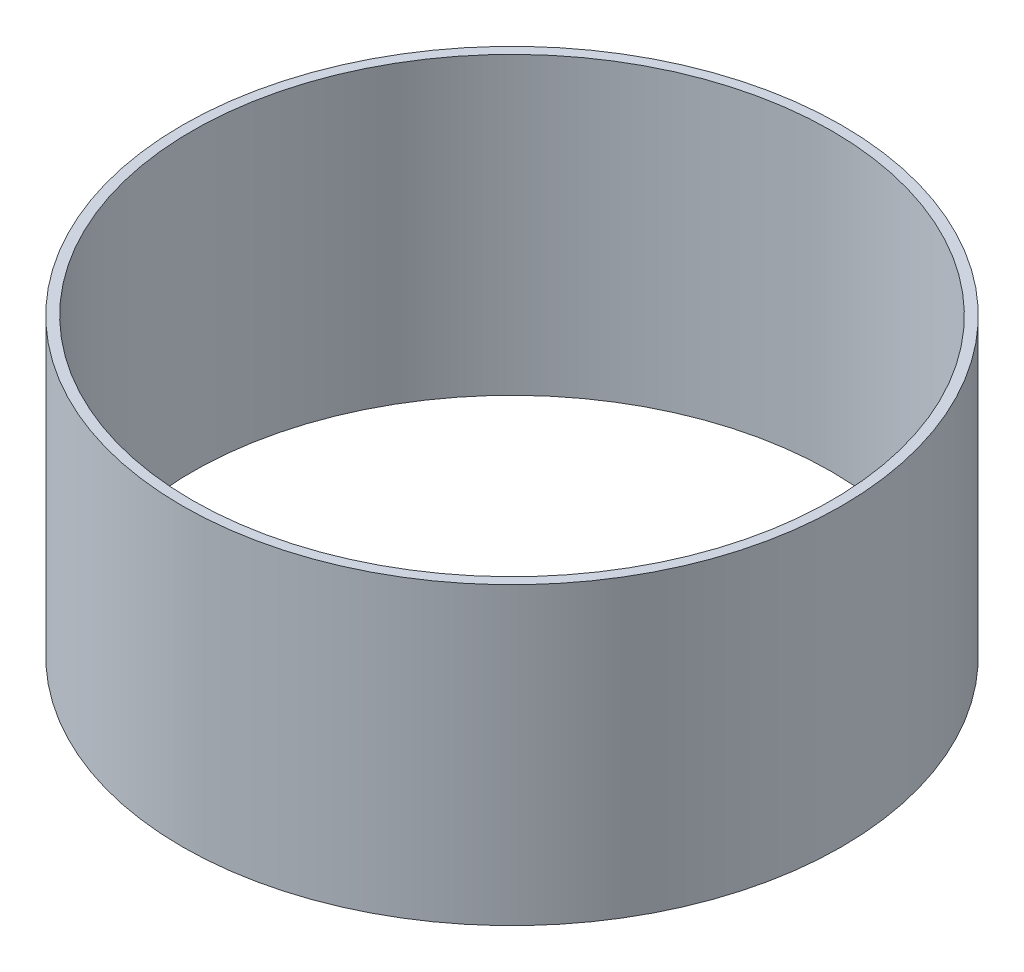
ISO-10303-21;
HEADER;
FILE_DESCRIPTION(('STEP AP214'),'2;1');
FILE_NAME('part.step','',(''),(''),'','','');
FILE_SCHEMA(('AUTOMOTIVE_DESIGN { 1 0 10303 214 1 1 1 1 }'));
ENDSEC;
DATA;
#1=APPLICATION_CONTEXT('core data for automotive mechanical design processes');
#2=APPLICATION_PROTOCOL_DEFINITION('international standard','automotive_design',2000,#1);
#3=PRODUCT_CONTEXT('',#1,'mechanical');
#4=PRODUCT('Part','Part','',(#3));
#5=PRODUCT_RELATED_PRODUCT_CATEGORY('part','',(#4));
#6=PRODUCT_DEFINITION_FORMATION('','',#4);
#7=PRODUCT_DEFINITION_CONTEXT('part definition',#1,'design');
#8=PRODUCT_DEFINITION('design','',#6,#7);
#9=PRODUCT_DEFINITION_SHAPE('','',#8);
#10=(LENGTH_UNIT() NAMED_UNIT(*) SI_UNIT(.MILLI.,.METRE.));
#11=(NAMED_UNIT(*) PLANE_ANGLE_UNIT() SI_UNIT($,.RADIAN.));
#12=(NAMED_UNIT(*) SI_UNIT($,.STERADIAN.) SOLID_ANGLE_UNIT());
#13=UNCERTAINTY_MEASURE_WITH_UNIT(LENGTH_MEASURE(1.E-05),#10,'distance_accuracy_value','');
#14=(GEOMETRIC_REPRESENTATION_CONTEXT(3) GLOBAL_UNCERTAINTY_ASSIGNED_CONTEXT((#13)) GLOBAL_UNIT_ASSIGNED_CONTEXT((#10,
#11,#12)) REPRESENTATION_CONTEXT('',''));
#15=CARTESIAN_POINT('',(0.,0.,0.));
#16=DIRECTION('',(0.,0.,1.));
#17=DIRECTION('',(1.,0.,0.));
#18=AXIS2_PLACEMENT_3D('',#15,#16,#17);
#19=CARTESIAN_POINT('',(0.,30.,0.));
#20=DIRECTION('',(0.,1.,0.));
#21=DIRECTION('',(0.,0.,1.));
#22=AXIS2_PLACEMENT_3D('',#19,#20,#21);
#23=PLANE('',#22);
#24=CARTESIAN_POINT('',(0.,30.,0.));
#25=DIRECTION('',(0.,1.,0.));
#26=DIRECTION('',(0.,0.,1.));
#27=AXIS2_PLACEMENT_3D('',#24,#25,#26);
#28=CIRCLE('',#27,33.5);
#29=CARTESIAN_POINT('',(0.,30.,33.5));
#30=VERTEX_POINT('',#29);
#31=EDGE_CURVE('E10',#30,#30,#28,.T.);
#32=ORIENTED_EDGE('',*,*,#31,.T.);
#33=EDGE_LOOP('',(#32));
#34=FACE_BOUND('',#33,.T.);
#35=CARTESIAN_POINT('',(0.,30.,0.));
#36=DIRECTION('',(0.,1.,0.));
#37=DIRECTION('',(0.,0.,1.));
#38=AXIS2_PLACEMENT_3D('',#35,#36,#37);
#39=CIRCLE('',#38,32.5);
#40=CARTESIAN_POINT('',(0.,30.,32.5));
#41=VERTEX_POINT('',#40);
#42=EDGE_CURVE('E50',#41,#41,#39,.T.);
#43=ORIENTED_EDGE('',*,*,#42,.F.);
#44=EDGE_LOOP('',(#43));
#45=FACE_BOUND('',#44,.T.);
#46=ADVANCED_FACE('F37',(#34,#45),#23,.T.);
#47=CARTESIAN_POINT('',(0.,0.,0.));
#48=DIRECTION('',(0.,1.,0.));
#49=DIRECTION('',(0.,0.,1.));
#50=AXIS2_PLACEMENT_3D('',#47,#48,#49);
#51=PLANE('',#50);
#52=CARTESIAN_POINT('',(0.,0.,0.));
#53=DIRECTION('',(0.,1.,0.));
#54=DIRECTION('',(0.,0.,1.));
#55=AXIS2_PLACEMENT_3D('',#52,#53,#54);
#56=CIRCLE('',#55,33.5);
#57=CARTESIAN_POINT('',(0.,0.,33.5));
#58=VERTEX_POINT('',#57);
#59=EDGE_CURVE('E41',#58,#58,#56,.T.);
#60=ORIENTED_EDGE('',*,*,#59,.F.);
#61=EDGE_LOOP('',(#60));
#62=FACE_BOUND('',#61,.T.);
#63=CARTESIAN_POINT('',(0.,0.,0.));
#64=DIRECTION('',(0.,1.,0.));
#65=DIRECTION('',(0.,0.,1.));
#66=AXIS2_PLACEMENT_3D('',#63,#64,#65);
#67=CIRCLE('',#66,32.5);
#68=CARTESIAN_POINT('',(0.,0.,32.5));
#69=VERTEX_POINT('',#68);
#70=EDGE_CURVE('E52',#69,#69,#67,.T.);
#71=ORIENTED_EDGE('',*,*,#70,.T.);
#72=EDGE_LOOP('',(#71));
#73=FACE_BOUND('',#72,.T.);
#74=ADVANCED_FACE('F64',(#62,#73),#51,.F.);
#75=CARTESIAN_POINT('',(0.,30.,0.));
#76=DIRECTION('',(0.,-1.,0.));
#77=DIRECTION('',(0.,0.,-1.));
#78=AXIS2_PLACEMENT_3D('',#75,#76,#77);
#79=CYLINDRICAL_SURFACE('',#78,33.5);
#80=ORIENTED_EDGE('',*,*,#31,.F.);
#81=EDGE_LOOP('',(#80));
#82=FACE_BOUND('',#81,.T.);
#83=ORIENTED_EDGE('',*,*,#59,.T.);
#84=EDGE_LOOP('',(#83));
#85=FACE_BOUND('',#84,.T.);
#86=ADVANCED_FACE('F39',(#82,#85),#79,.T.);
#87=CARTESIAN_POINT('',(0.,30.,0.));
#88=DIRECTION('',(0.,-1.,0.));
#89=DIRECTION('',(0.,0.,-1.));
#90=AXIS2_PLACEMENT_3D('',#87,#88,#89);
#91=CYLINDRICAL_SURFACE('',#90,32.5);
#92=ORIENTED_EDGE('',*,*,#42,.T.);
#93=EDGE_LOOP('',(#92));
#94=FACE_BOUND('',#93,.T.);
#95=ORIENTED_EDGE('',*,*,#70,.F.);
#96=EDGE_LOOP('',(#95));
#97=FACE_BOUND('',#96,.T.);
#98=ADVANCED_FACE('F60',(#94,#97),#91,.F.);
#99=CLOSED_SHELL('',(#46,#74,#86,#98));
#100=MANIFOLD_SOLID_BREP('B2',#99);
#101=ADVANCED_BREP_SHAPE_REPRESENTATION('',(#18,#100),#14);
#102=SHAPE_DEFINITION_REPRESENTATION(#9,#101);
ENDSEC;
END-ISO-10303-21;
